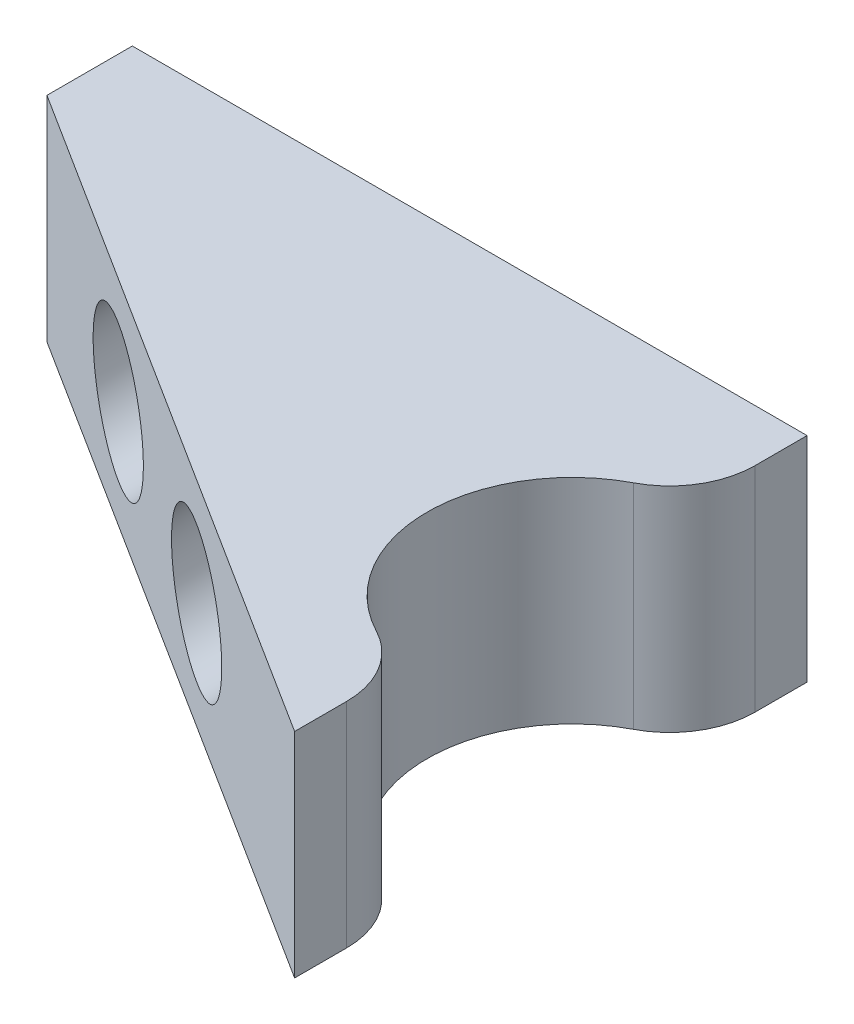
ISO-10303-21;
HEADER;
FILE_DESCRIPTION(('STEP AP214'),'2;1');
FILE_NAME('part.step','',(''),(''),'','','');
FILE_SCHEMA(('AUTOMOTIVE_DESIGN { 1 0 10303 214 1 1 1 1 }'));
ENDSEC;
DATA;
#1=APPLICATION_CONTEXT('core data for automotive mechanical design processes');
#2=APPLICATION_PROTOCOL_DEFINITION('international standard','automotive_design',2000,#1);
#3=PRODUCT_CONTEXT('',#1,'mechanical');
#4=PRODUCT('Part','Part','',(#3));
#5=PRODUCT_RELATED_PRODUCT_CATEGORY('part','',(#4));
#6=PRODUCT_DEFINITION_FORMATION('','',#4);
#7=PRODUCT_DEFINITION_CONTEXT('part definition',#1,'design');
#8=PRODUCT_DEFINITION('design','',#6,#7);
#9=PRODUCT_DEFINITION_SHAPE('','',#8);
#10=(LENGTH_UNIT() NAMED_UNIT(*) SI_UNIT(.MILLI.,.METRE.));
#11=(NAMED_UNIT(*) PLANE_ANGLE_UNIT() SI_UNIT($,.RADIAN.));
#12=(NAMED_UNIT(*) SI_UNIT($,.STERADIAN.) SOLID_ANGLE_UNIT());
#13=UNCERTAINTY_MEASURE_WITH_UNIT(LENGTH_MEASURE(1.E-05),#10,'distance_accuracy_value','');
#14=(GEOMETRIC_REPRESENTATION_CONTEXT(3) GLOBAL_UNCERTAINTY_ASSIGNED_CONTEXT((#13)) GLOBAL_UNIT_ASSIGNED_CONTEXT((#10,
#11,#12)) REPRESENTATION_CONTEXT('',''));
#15=CARTESIAN_POINT('',(0.,0.,0.));
#16=DIRECTION('',(0.,0.,1.));
#17=DIRECTION('',(1.,0.,0.));
#18=AXIS2_PLACEMENT_3D('',#15,#16,#17);
#19=CARTESIAN_POINT('',(0.,0.,0.));
#20=DIRECTION('',(0.,0.,-1.));
#21=DIRECTION('',(-1.,0.,0.));
#22=AXIS2_PLACEMENT_3D('',#19,#20,#21);
#23=PLANE('',#22);
#24=CARTESIAN_POINT('',(-10.63625,0.,0.));
#25=DIRECTION('',(0.,0.,1.));
#26=DIRECTION('',(1.,0.,0.));
#27=AXIS2_PLACEMENT_3D('',#24,#25,#26);
#28=CIRCLE('',#27,3.302);
#29=CARTESIAN_POINT('',(-7.33425000000001,0.,0.));
#30=VERTEX_POINT('',#29);
#31=EDGE_CURVE('E162',#30,#30,#28,.T.);
#32=ORIENTED_EDGE('',*,*,#31,.T.);
#33=EDGE_LOOP('',(#32));
#34=FACE_BOUND('',#33,.T.);
#35=DIRECTION('',(0.,1.,0.));
#36=VECTOR('',#35,1.);
#37=CARTESIAN_POINT('',(-25.0825,-7.9375,0.));
#38=LINE('',#37,#36);
#39=CARTESIAN_POINT('',(-25.0825,-7.9375,0.));
#40=VERTEX_POINT('',#39);
#41=CARTESIAN_POINT('',(-25.0825,7.9375,0.));
#42=VERTEX_POINT('',#41);
#43=EDGE_CURVE('E169',#40,#42,#38,.T.);
#44=ORIENTED_EDGE('',*,*,#43,.T.);
#45=DIRECTION('',(1.,0.,0.));
#46=VECTOR('',#45,1.);
#47=CARTESIAN_POINT('',(-25.0825,7.9375,0.));
#48=LINE('',#47,#46);
#49=CARTESIAN_POINT('',(25.0825,7.9375,0.));
#50=VERTEX_POINT('',#49);
#51=EDGE_CURVE('E175',#42,#50,#48,.T.);
#52=ORIENTED_EDGE('',*,*,#51,.T.);
#53=DIRECTION('',(0.,1.,0.));
#54=VECTOR('',#53,1.);
#55=CARTESIAN_POINT('',(25.0825,-7.9375,0.));
#56=LINE('',#55,#54);
#57=CARTESIAN_POINT('',(25.0825,-7.9375,0.));
#58=VERTEX_POINT('',#57);
#59=EDGE_CURVE('E178',#58,#50,#56,.T.);
#60=ORIENTED_EDGE('',*,*,#59,.F.);
#61=DIRECTION('',(1.,0.,0.));
#62=VECTOR('',#61,1.);
#63=CARTESIAN_POINT('',(-25.0825,-7.9375,0.));
#64=LINE('',#63,#62);
#65=EDGE_CURVE('E172',#40,#58,#64,.T.);
#66=ORIENTED_EDGE('',*,*,#65,.F.);
#67=EDGE_LOOP('',(#44,#52,#60,#66));
#68=FACE_BOUND('',#67,.T.);
#69=CARTESIAN_POINT('',(5.23875,0.,0.));
#70=DIRECTION('',(0.,0.,1.));
#71=DIRECTION('',(1.,0.,0.));
#72=AXIS2_PLACEMENT_3D('',#69,#70,#71);
#73=CIRCLE('',#72,3.302);
#74=CARTESIAN_POINT('',(8.54075,0.,0.));
#75=VERTEX_POINT('',#74);
#76=EDGE_CURVE('E159',#75,#75,#73,.T.);
#77=ORIENTED_EDGE('',*,*,#76,.T.);
#78=EDGE_LOOP('',(#77));
#79=FACE_BOUND('',#78,.T.);
#80=ADVANCED_FACE('F72',(#34,#68,#79),#23,.T.);
#81=CARTESIAN_POINT('',(-25.0825,-7.9375,6.35));
#82=DIRECTION('',(-1.,0.,0.));
#83=DIRECTION('',(0.,0.,1.));
#84=AXIS2_PLACEMENT_3D('',#81,#82,#83);
#85=PLANE('',#84);
#86=ORIENTED_EDGE('',*,*,#43,.F.);
#87=DIRECTION('',(0.,0.,-1.));
#88=VECTOR('',#87,1.);
#89=CARTESIAN_POINT('',(-25.0825,-7.9375,6.35));
#90=LINE('',#89,#88);
#91=CARTESIAN_POINT('',(-25.0825,-7.9375,6.35));
#92=VERTEX_POINT('',#91);
#93=EDGE_CURVE('E183',#92,#40,#90,.T.);
#94=ORIENTED_EDGE('',*,*,#93,.F.);
#95=DIRECTION('',(0.,1.,0.));
#96=VECTOR('',#95,1.);
#97=CARTESIAN_POINT('',(-25.0825,-7.9375,6.35));
#98=LINE('',#97,#96);
#99=CARTESIAN_POINT('',(-25.0825,7.9375,6.35));
#100=VERTEX_POINT('',#99);
#101=EDGE_CURVE('E170',#92,#100,#98,.T.);
#102=ORIENTED_EDGE('',*,*,#101,.T.);
#103=DIRECTION('',(0.,0.,-1.));
#104=VECTOR('',#103,1.);
#105=CARTESIAN_POINT('',(-25.0825,7.9375,6.35));
#106=LINE('',#105,#104);
#107=EDGE_CURVE('E152',#100,#42,#106,.T.);
#108=ORIENTED_EDGE('',*,*,#107,.T.);
#109=EDGE_LOOP('',(#86,#94,#102,#108));
#110=FACE_BOUND('',#109,.T.);
#111=ADVANCED_FACE('F242',(#110),#85,.T.);
#112=CARTESIAN_POINT('',(-25.0825,-7.9375,6.35));
#113=DIRECTION('',(0.,1.,0.));
#114=DIRECTION('',(0.,0.,1.));
#115=AXIS2_PLACEMENT_3D('',#112,#113,#114);
#116=PLANE('',#115);
#117=CARTESIAN_POINT('',(26.67,-7.9375,19.05));
#118=DIRECTION('',(0.,-1.,0.));
#119=DIRECTION('',(0.,0.,-1.));
#120=AXIS2_PLACEMENT_3D('',#117,#118,#119);
#121=CIRCLE('',#120,10.7854707940822);
#122=CARTESIAN_POINT('',(21.6739496751036,-7.9375,28.6085491263634));
#123=VERTEX_POINT('',#122);
#124=CARTESIAN_POINT('',(21.6739496751036,-7.9375,9.49145087363659));
#125=VERTEX_POINT('',#124);
#126=EDGE_CURVE('E213',#123,#125,#121,.T.);
#127=ORIENTED_EDGE('',*,*,#126,.F.);
#128=CARTESIAN_POINT('',(18.7325,-7.9375,34.2361928436605));
#129=DIRECTION('',(0.,1.,0.));
#130=DIRECTION('',(0.,0.,1.));
#131=AXIS2_PLACEMENT_3D('',#128,#129,#130);
#132=CIRCLE('',#131,6.35);
#133=CARTESIAN_POINT('',(25.0825,-7.9375,34.2361928436605));
#134=VERTEX_POINT('',#133);
#135=EDGE_CURVE('E197',#123,#134,#132,.F.);
#136=ORIENTED_EDGE('',*,*,#135,.T.);
#137=DIRECTION('',(0.,0.,1.));
#138=VECTOR('',#137,1.);
#139=CARTESIAN_POINT('',(25.0825,-7.9375,0.));
#140=LINE('',#139,#138);
#141=CARTESIAN_POINT('',(25.0825,-7.9375,38.1));
#142=VERTEX_POINT('',#141);
#143=EDGE_CURVE('E217',#134,#142,#140,.T.);
#144=ORIENTED_EDGE('',*,*,#143,.T.);
#145=DIRECTION('',(0.84498019748951,0.,0.534797593347791));
#146=VECTOR('',#145,1.);
#147=CARTESIAN_POINT('',(-10.0433302825764,-7.9375,15.8684618464707));
#148=LINE('',#147,#146);
#149=EDGE_CURVE('E158',#92,#142,#148,.T.);
#150=ORIENTED_EDGE('',*,*,#149,.F.);
#151=ORIENTED_EDGE('',*,*,#93,.T.);
#152=ORIENTED_EDGE('',*,*,#65,.T.);
#153=DIRECTION('',(0.,0.,-1.));
#154=VECTOR('',#153,1.);
#155=CARTESIAN_POINT('',(25.0825,-7.9375,6.35));
#156=LINE('',#155,#154);
#157=CARTESIAN_POINT('',(25.0825,-7.9375,3.86380715633954));
#158=VERTEX_POINT('',#157);
#159=EDGE_CURVE('E186',#158,#58,#156,.T.);
#160=ORIENTED_EDGE('',*,*,#159,.F.);
#161=CARTESIAN_POINT('',(18.7325,-7.9375,3.86380715633954));
#162=DIRECTION('',(0.,1.,0.));
#163=DIRECTION('',(0.,0.,1.));
#164=AXIS2_PLACEMENT_3D('',#161,#162,#163);
#165=CIRCLE('',#164,6.35);
#166=EDGE_CURVE('E195',#158,#125,#165,.F.);
#167=ORIENTED_EDGE('',*,*,#166,.T.);
#168=EDGE_LOOP('',(#127,#136,#144,#150,#151,#152,#160,#167));
#169=FACE_BOUND('',#168,.T.);
#170=ADVANCED_FACE('F248',(#169),#116,.F.);
#171=CARTESIAN_POINT('',(25.0825,-7.9375,6.35));
#172=DIRECTION('',(-1.,0.,0.));
#173=DIRECTION('',(0.,0.,1.));
#174=AXIS2_PLACEMENT_3D('',#171,#172,#173);
#175=PLANE('',#174);
#176=DIRECTION('',(0.,0.,-1.));
#177=VECTOR('',#176,1.);
#178=CARTESIAN_POINT('',(25.0825,7.9375,6.35));
#179=LINE('',#178,#177);
#180=CARTESIAN_POINT('',(25.0825,7.9375,3.86380715633954));
#181=VERTEX_POINT('',#180);
#182=EDGE_CURVE('E188',#181,#50,#179,.T.);
#183=ORIENTED_EDGE('',*,*,#182,.F.);
#184=DIRECTION('',(0.,-1.,0.));
#185=VECTOR('',#184,1.);
#186=CARTESIAN_POINT('',(25.0825,-7.9375,3.86380715633954));
#187=LINE('',#186,#185);
#188=EDGE_CURVE('E12',#181,#158,#187,.T.);
#189=ORIENTED_EDGE('',*,*,#188,.T.);
#190=ORIENTED_EDGE('',*,*,#159,.T.);
#191=ORIENTED_EDGE('',*,*,#59,.T.);
#192=EDGE_LOOP('',(#183,#189,#190,#191));
#193=FACE_BOUND('',#192,.T.);
#194=ADVANCED_FACE('F258',(#193),#175,.F.);
#195=CARTESIAN_POINT('',(-25.0825,7.9375,6.35));
#196=DIRECTION('',(0.,1.,0.));
#197=DIRECTION('',(0.,0.,1.));
#198=AXIS2_PLACEMENT_3D('',#195,#196,#197);
#199=PLANE('',#198);
#200=DIRECTION('',(0.,0.,1.));
#201=VECTOR('',#200,1.);
#202=CARTESIAN_POINT('',(25.0825,7.9375,0.));
#203=LINE('',#202,#201);
#204=CARTESIAN_POINT('',(25.0825,7.9375,34.2361928436605));
#205=VERTEX_POINT('',#204);
#206=CARTESIAN_POINT('',(25.0825,7.9375,38.1));
#207=VERTEX_POINT('',#206);
#208=EDGE_CURVE('E139',#205,#207,#203,.T.);
#209=ORIENTED_EDGE('',*,*,#208,.F.);
#210=CARTESIAN_POINT('',(18.7325,7.9375,34.2361928436605));
#211=DIRECTION('',(0.,1.,0.));
#212=DIRECTION('',(0.,0.,1.));
#213=AXIS2_PLACEMENT_3D('',#210,#211,#212);
#214=CIRCLE('',#213,6.35);
#215=CARTESIAN_POINT('',(21.6739496751036,7.9375,28.6085491263634));
#216=VERTEX_POINT('',#215);
#217=EDGE_CURVE('E81',#205,#216,#214,.T.);
#218=ORIENTED_EDGE('',*,*,#217,.T.);
#219=CARTESIAN_POINT('',(26.67,7.9375,19.05));
#220=DIRECTION('',(0.,-1.,0.));
#221=DIRECTION('',(0.,0.,-1.));
#222=AXIS2_PLACEMENT_3D('',#219,#220,#221);
#223=CIRCLE('',#222,10.7854707940822);
#224=CARTESIAN_POINT('',(21.6739496751036,7.9375,9.49145087363659));
#225=VERTEX_POINT('',#224);
#226=EDGE_CURVE('E147',#216,#225,#223,.T.);
#227=ORIENTED_EDGE('',*,*,#226,.T.);
#228=CARTESIAN_POINT('',(18.7325,7.9375,3.86380715633954));
#229=DIRECTION('',(0.,1.,0.));
#230=DIRECTION('',(0.,0.,1.));
#231=AXIS2_PLACEMENT_3D('',#228,#229,#230);
#232=CIRCLE('',#231,6.35);
#233=EDGE_CURVE('E89',#225,#181,#232,.T.);
#234=ORIENTED_EDGE('',*,*,#233,.T.);
#235=ORIENTED_EDGE('',*,*,#182,.T.);
#236=ORIENTED_EDGE('',*,*,#51,.F.);
#237=ORIENTED_EDGE('',*,*,#107,.F.);
#238=DIRECTION('',(0.84498019748951,0.,0.534797593347791));
#239=VECTOR('',#238,1.);
#240=CARTESIAN_POINT('',(-10.0433302825764,7.9375,15.8684618464707));
#241=LINE('',#240,#239);
#242=EDGE_CURVE('E146',#100,#207,#241,.T.);
#243=ORIENTED_EDGE('',*,*,#242,.T.);
#244=EDGE_LOOP('',(#209,#218,#227,#234,#235,#236,#237,#243));
#245=FACE_BOUND('',#244,.T.);
#246=ADVANCED_FACE('F150',(#245),#199,.T.);
#247=CARTESIAN_POINT('',(-10.63625,0.,6.35));
#248=DIRECTION('',(0.,0.,-1.));
#249=DIRECTION('',(-1.,0.,0.));
#250=AXIS2_PLACEMENT_3D('',#247,#248,#249);
#251=CYLINDRICAL_SURFACE('',#250,3.302);
#252=CARTESIAN_POINT('',(-10.63625,0.,6.35));
#253=DIRECTION('',(0.,0.,-1.));
#254=DIRECTION('',(-1.,0.,0.));
#255=AXIS2_PLACEMENT_3D('',#252,#253,#254);
#256=CIRCLE('',#255,3.302);
#257=CARTESIAN_POINT('',(-13.93825,0.,6.35));
#258=VERTEX_POINT('',#257);
#259=EDGE_CURVE('E76',#258,#258,#256,.T.);
#260=ORIENTED_EDGE('',*,*,#259,.F.);
#261=EDGE_LOOP('',(#260));
#262=FACE_BOUND('',#261,.T.);
#263=ORIENTED_EDGE('',*,*,#31,.F.);
#264=EDGE_LOOP('',(#263));
#265=FACE_BOUND('',#264,.T.);
#266=ADVANCED_FACE('F254',(#262,#265),#251,.F.);
#267=CARTESIAN_POINT('',(5.23875,0.,6.35));
#268=DIRECTION('',(0.,0.,-1.));
#269=DIRECTION('',(-1.,0.,0.));
#270=AXIS2_PLACEMENT_3D('',#267,#268,#269);
#271=CYLINDRICAL_SURFACE('',#270,3.302);
#272=CARTESIAN_POINT('',(5.23875,0.,6.35));
#273=DIRECTION('',(0.,0.,-1.));
#274=DIRECTION('',(-1.,0.,0.));
#275=AXIS2_PLACEMENT_3D('',#272,#273,#274);
#276=CIRCLE('',#275,3.302);
#277=CARTESIAN_POINT('',(1.93675,0.,6.35));
#278=VERTEX_POINT('',#277);
#279=EDGE_CURVE('E208',#278,#278,#276,.T.);
#280=ORIENTED_EDGE('',*,*,#279,.F.);
#281=EDGE_LOOP('',(#280));
#282=FACE_BOUND('',#281,.T.);
#283=ORIENTED_EDGE('',*,*,#76,.F.);
#284=EDGE_LOOP('',(#283));
#285=FACE_BOUND('',#284,.T.);
#286=ADVANCED_FACE('F286',(#282,#285),#271,.F.);
#287=CARTESIAN_POINT('',(-10.0433302825764,7.9375,15.8684618464707));
#288=DIRECTION('',(0.534797593347791,0.,-0.84498019748951));
#289=DIRECTION('',(-0.84498019748951,0.,-0.534797593347791));
#290=AXIS2_PLACEMENT_3D('',#287,#288,#289);
#291=PLANE('',#290);
#292=CARTESIAN_POINT('',(-10.63625,0.,15.4931962025316));
#293=DIRECTION('',(0.534797593347791,0.,-0.84498019748951));
#294=DIRECTION('',(-0.84498019748951,0.,-0.534797593347791));
#295=AXIS2_PLACEMENT_3D('',#292,#293,#294);
#296=ELLIPSE('',#295,6.0119752097067,5.08);
#297=CARTESIAN_POINT('',(-15.71625,0.,12.2780063291139));
#298=VERTEX_POINT('',#297);
#299=EDGE_CURVE('E205',#298,#298,#296,.T.);
#300=ORIENTED_EDGE('',*,*,#299,.T.);
#301=EDGE_LOOP('',(#300));
#302=FACE_BOUND('',#301,.T.);
#303=CARTESIAN_POINT('',(5.23875,0.,25.540664556962));
#304=DIRECTION('',(0.534797593347791,0.,-0.84498019748951));
#305=DIRECTION('',(-0.84498019748951,0.,-0.534797593347791));
#306=AXIS2_PLACEMENT_3D('',#303,#304,#305);
#307=ELLIPSE('',#306,6.0119752097067,5.08);
#308=CARTESIAN_POINT('',(0.158749999999997,0.,22.3254746835443));
#309=VERTEX_POINT('',#308);
#310=EDGE_CURVE('E202',#309,#309,#307,.T.);
#311=ORIENTED_EDGE('',*,*,#310,.T.);
#312=EDGE_LOOP('',(#311));
#313=FACE_BOUND('',#312,.T.);
#314=ORIENTED_EDGE('',*,*,#149,.T.);
#315=DIRECTION('',(0.,-1.,0.));
#316=VECTOR('',#315,1.);
#317=CARTESIAN_POINT('',(25.0825,7.9375,38.1));
#318=LINE('',#317,#316);
#319=EDGE_CURVE('E143',#207,#142,#318,.T.);
#320=ORIENTED_EDGE('',*,*,#319,.F.);
#321=ORIENTED_EDGE('',*,*,#242,.F.);
#322=ORIENTED_EDGE('',*,*,#101,.F.);
#323=EDGE_LOOP('',(#314,#320,#321,#322));
#324=FACE_BOUND('',#323,.T.);
#325=ADVANCED_FACE('F156',(#302,#313,#324),#291,.F.);
#326=CARTESIAN_POINT('',(25.0825,7.9375,0.));
#327=DIRECTION('',(1.,0.,0.));
#328=DIRECTION('',(0.,0.,-1.));
#329=AXIS2_PLACEMENT_3D('',#326,#327,#328);
#330=PLANE('',#329);
#331=ORIENTED_EDGE('',*,*,#143,.F.);
#332=DIRECTION('',(0.,1.,0.));
#333=VECTOR('',#332,1.);
#334=CARTESIAN_POINT('',(25.0825,7.9375,34.2361928436605));
#335=LINE('',#334,#333);
#336=EDGE_CURVE('E97',#134,#205,#335,.T.);
#337=ORIENTED_EDGE('',*,*,#336,.T.);
#338=ORIENTED_EDGE('',*,*,#208,.T.);
#339=ORIENTED_EDGE('',*,*,#319,.T.);
#340=EDGE_LOOP('',(#331,#337,#338,#339));
#341=FACE_BOUND('',#340,.T.);
#342=ADVANCED_FACE('F141',(#341),#330,.T.);
#343=CARTESIAN_POINT('',(26.67,7.9375,19.05));
#344=DIRECTION('',(0.,-1.,0.));
#345=DIRECTION('',(0.,0.,-1.));
#346=AXIS2_PLACEMENT_3D('',#343,#344,#345);
#347=CYLINDRICAL_SURFACE('',#346,10.7854707940822);
#348=ORIENTED_EDGE('',*,*,#226,.F.);
#349=DIRECTION('',(0.,-1.,0.));
#350=VECTOR('',#349,1.);
#351=CARTESIAN_POINT('',(21.6739496751036,7.9375,28.6085491263634));
#352=LINE('',#351,#350);
#353=EDGE_CURVE('E192',#216,#123,#352,.T.);
#354=ORIENTED_EDGE('',*,*,#353,.T.);
#355=ORIENTED_EDGE('',*,*,#126,.T.);
#356=DIRECTION('',(0.,-1.,0.));
#357=VECTOR('',#356,1.);
#358=CARTESIAN_POINT('',(21.6739496751036,7.9375,9.49145087363659));
#359=LINE('',#358,#357);
#360=EDGE_CURVE('E185',#125,#225,#359,.F.);
#361=ORIENTED_EDGE('',*,*,#360,.T.);
#362=EDGE_LOOP('',(#348,#354,#355,#361));
#363=FACE_BOUND('',#362,.T.);
#364=ADVANCED_FACE('F266',(#363),#347,.F.);
#365=CARTESIAN_POINT('',(18.7325,7.9375,34.2361928436605));
#366=DIRECTION('',(0.,-1.,0.));
#367=DIRECTION('',(0.,0.,-1.));
#368=AXIS2_PLACEMENT_3D('',#365,#366,#367);
#369=CYLINDRICAL_SURFACE('',#368,6.35);
#370=ORIENTED_EDGE('',*,*,#217,.F.);
#371=ORIENTED_EDGE('',*,*,#336,.F.);
#372=ORIENTED_EDGE('',*,*,#135,.F.);
#373=ORIENTED_EDGE('',*,*,#353,.F.);
#374=EDGE_LOOP('',(#370,#371,#372,#373));
#375=FACE_BOUND('',#374,.T.);
#376=ADVANCED_FACE('F264',(#375),#369,.T.);
#377=CARTESIAN_POINT('',(18.7325,7.9375,3.86380715633954));
#378=DIRECTION('',(0.,-1.,0.));
#379=DIRECTION('',(0.,0.,-1.));
#380=AXIS2_PLACEMENT_3D('',#377,#378,#379);
#381=CYLINDRICAL_SURFACE('',#380,6.35);
#382=ORIENTED_EDGE('',*,*,#233,.F.);
#383=ORIENTED_EDGE('',*,*,#360,.F.);
#384=ORIENTED_EDGE('',*,*,#166,.F.);
#385=ORIENTED_EDGE('',*,*,#188,.F.);
#386=EDGE_LOOP('',(#382,#383,#384,#385));
#387=FACE_BOUND('',#386,.T.);
#388=ADVANCED_FACE('F74',(#387),#381,.T.);
#389=CARTESIAN_POINT('',(5.23875,0.,38.1));
#390=DIRECTION('',(0.,0.,-1.));
#391=DIRECTION('',(-1.,0.,0.));
#392=AXIS2_PLACEMENT_3D('',#389,#390,#391);
#393=CYLINDRICAL_SURFACE('',#392,5.08);
#394=CARTESIAN_POINT('',(5.23875,0.,6.35));
#395=DIRECTION('',(0.,0.,-1.));
#396=DIRECTION('',(-1.,0.,0.));
#397=AXIS2_PLACEMENT_3D('',#394,#395,#396);
#398=CIRCLE('',#397,5.08);
#399=CARTESIAN_POINT('',(0.158749999999997,0.,6.35));
#400=VERTEX_POINT('',#399);
#401=EDGE_CURVE('E224',#400,#400,#398,.T.);
#402=ORIENTED_EDGE('',*,*,#401,.T.);
#403=EDGE_LOOP('',(#402));
#404=FACE_BOUND('',#403,.T.);
#405=ORIENTED_EDGE('',*,*,#310,.F.);
#406=EDGE_LOOP('',(#405));
#407=FACE_BOUND('',#406,.T.);
#408=ADVANCED_FACE('F272',(#404,#407),#393,.F.);
#409=CARTESIAN_POINT('',(5.23875,0.,6.35));
#410=DIRECTION('',(0.,0.,-1.));
#411=DIRECTION('',(-1.,0.,0.));
#412=AXIS2_PLACEMENT_3D('',#409,#410,#411);
#413=PLANE('',#412);
#414=ORIENTED_EDGE('',*,*,#279,.T.);
#415=EDGE_LOOP('',(#414));
#416=FACE_BOUND('',#415,.T.);
#417=ORIENTED_EDGE('',*,*,#401,.F.);
#418=EDGE_LOOP('',(#417));
#419=FACE_BOUND('',#418,.T.);
#420=ADVANCED_FACE('F239',(#416,#419),#413,.F.);
#421=CARTESIAN_POINT('',(-10.63625,0.,38.1));
#422=DIRECTION('',(0.,0.,-1.));
#423=DIRECTION('',(-1.,0.,0.));
#424=AXIS2_PLACEMENT_3D('',#421,#422,#423);
#425=CYLINDRICAL_SURFACE('',#424,5.08);
#426=CARTESIAN_POINT('',(-10.63625,0.,6.35));
#427=DIRECTION('',(0.,0.,-1.));
#428=DIRECTION('',(-1.,0.,0.));
#429=AXIS2_PLACEMENT_3D('',#426,#427,#428);
#430=CIRCLE('',#429,5.08);
#431=CARTESIAN_POINT('',(-15.71625,0.,6.35));
#432=VERTEX_POINT('',#431);
#433=EDGE_CURVE('E206',#432,#432,#430,.T.);
#434=ORIENTED_EDGE('',*,*,#433,.T.);
#435=EDGE_LOOP('',(#434));
#436=FACE_BOUND('',#435,.T.);
#437=ORIENTED_EDGE('',*,*,#299,.F.);
#438=EDGE_LOOP('',(#437));
#439=FACE_BOUND('',#438,.T.);
#440=ADVANCED_FACE('F230',(#436,#439),#425,.F.);
#441=CARTESIAN_POINT('',(-10.63625,0.,6.35));
#442=DIRECTION('',(0.,0.,-1.));
#443=DIRECTION('',(-1.,0.,0.));
#444=AXIS2_PLACEMENT_3D('',#441,#442,#443);
#445=PLANE('',#444);
#446=ORIENTED_EDGE('',*,*,#259,.T.);
#447=EDGE_LOOP('',(#446));
#448=FACE_BOUND('',#447,.T.);
#449=ORIENTED_EDGE('',*,*,#433,.F.);
#450=EDGE_LOOP('',(#449));
#451=FACE_BOUND('',#450,.T.);
#452=ADVANCED_FACE('F233',(#448,#451),#445,.F.);
#453=CLOSED_SHELL('',(#80,#111,#170,#194,#246,#266,#286,#325,#342,#364,#376,#388,#408,#420,#440,#452));
#454=MANIFOLD_SOLID_BREP('B2',#453);
#455=ADVANCED_BREP_SHAPE_REPRESENTATION('',(#18,#454),#14);
#456=SHAPE_DEFINITION_REPRESENTATION(#9,#455);
ENDSEC;
END-ISO-10303-21;
